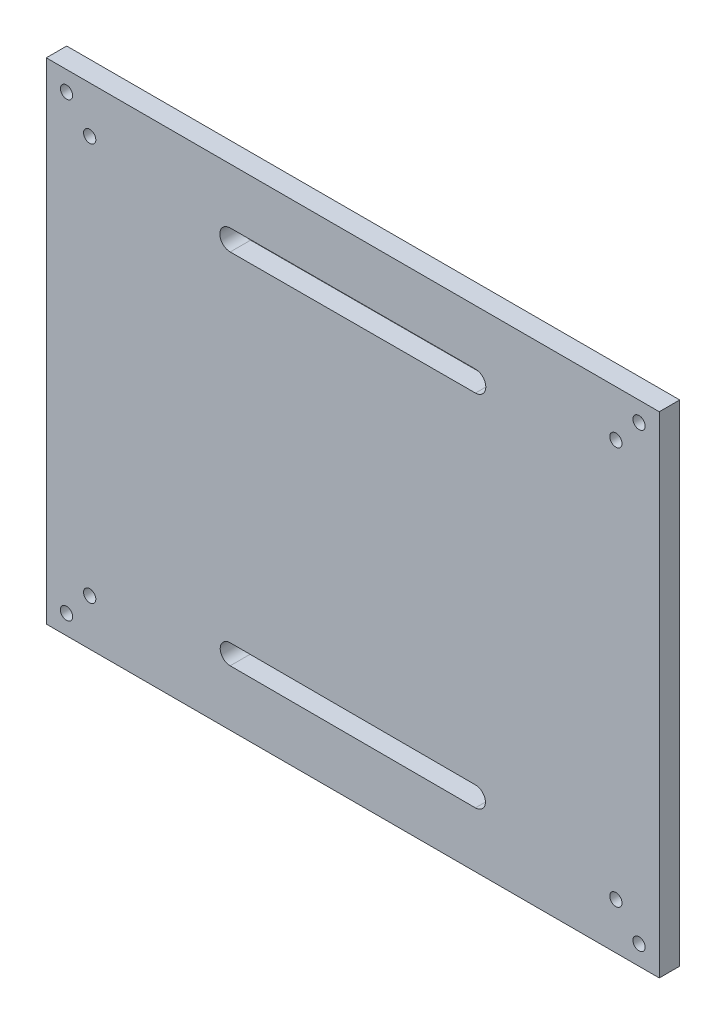
ISO-10303-21;
HEADER;
FILE_DESCRIPTION(('STEP AP214'),'2;1');
FILE_NAME('part.step','',(''),(''),'','','');
FILE_SCHEMA(('AUTOMOTIVE_DESIGN { 1 0 10303 214 1 1 1 1 }'));
ENDSEC;
DATA;
#1=APPLICATION_CONTEXT('core data for automotive mechanical design processes');
#2=APPLICATION_PROTOCOL_DEFINITION('international standard','automotive_design',2000,#1);
#3=PRODUCT_CONTEXT('',#1,'mechanical');
#4=PRODUCT('Part','Part','',(#3));
#5=PRODUCT_RELATED_PRODUCT_CATEGORY('part','',(#4));
#6=PRODUCT_DEFINITION_FORMATION('','',#4);
#7=PRODUCT_DEFINITION_CONTEXT('part definition',#1,'design');
#8=PRODUCT_DEFINITION('design','',#6,#7);
#9=PRODUCT_DEFINITION_SHAPE('','',#8);
#10=(LENGTH_UNIT() NAMED_UNIT(*) SI_UNIT(.MILLI.,.METRE.));
#11=(NAMED_UNIT(*) PLANE_ANGLE_UNIT() SI_UNIT($,.RADIAN.));
#12=(NAMED_UNIT(*) SI_UNIT($,.STERADIAN.) SOLID_ANGLE_UNIT());
#13=UNCERTAINTY_MEASURE_WITH_UNIT(LENGTH_MEASURE(1.E-05),#10,'distance_accuracy_value','');
#14=(GEOMETRIC_REPRESENTATION_CONTEXT(3) GLOBAL_UNCERTAINTY_ASSIGNED_CONTEXT((#13)) GLOBAL_UNIT_ASSIGNED_CONTEXT((#10,
#11,#12)) REPRESENTATION_CONTEXT('',''));
#15=CARTESIAN_POINT('',(0.,0.,0.));
#16=DIRECTION('',(0.,0.,1.));
#17=DIRECTION('',(1.,0.,0.));
#18=AXIS2_PLACEMENT_3D('',#15,#16,#17);
#19=CARTESIAN_POINT('',(0.,129.544898370349,5.));
#20=DIRECTION('',(0.,-1.,0.));
#21=DIRECTION('',(0.,0.,-1.));
#22=AXIS2_PLACEMENT_3D('',#19,#20,#21);
#23=PLANE('',#22);
#24=DIRECTION('',(-1.,0.,0.));
#25=VECTOR('',#24,1.);
#26=CARTESIAN_POINT('',(0.,129.544898370349,0.));
#27=LINE('',#26,#25);
#28=CARTESIAN_POINT('',(163.925313807853,129.544898370349,0.));
#29=VERTEX_POINT('',#28);
#30=CARTESIAN_POINT('',(13.9253138078526,129.544898370349,0.));
#31=VERTEX_POINT('',#30);
#32=EDGE_CURVE('E253',#29,#31,#27,.T.);
#33=ORIENTED_EDGE('',*,*,#32,.T.);
#34=DIRECTION('',(0.,0.,-1.));
#35=VECTOR('',#34,1.);
#36=CARTESIAN_POINT('',(13.9253138078526,129.544898370349,5.));
#37=LINE('',#36,#35);
#38=CARTESIAN_POINT('',(13.9253138078526,129.544898370349,5.));
#39=VERTEX_POINT('',#38);
#40=EDGE_CURVE('E11',#39,#31,#37,.T.);
#41=ORIENTED_EDGE('',*,*,#40,.F.);
#42=DIRECTION('',(-1.,0.,0.));
#43=VECTOR('',#42,1.);
#44=CARTESIAN_POINT('',(0.,129.544898370349,5.));
#45=LINE('',#44,#43);
#46=CARTESIAN_POINT('',(163.925313807853,129.544898370349,5.));
#47=VERTEX_POINT('',#46);
#48=EDGE_CURVE('E220',#47,#39,#45,.T.);
#49=ORIENTED_EDGE('',*,*,#48,.F.);
#50=DIRECTION('',(0.,0.,-1.));
#51=VECTOR('',#50,1.);
#52=CARTESIAN_POINT('',(163.925313807853,129.544898370349,5.));
#53=LINE('',#52,#51);
#54=EDGE_CURVE('E229',#47,#29,#53,.T.);
#55=ORIENTED_EDGE('',*,*,#54,.T.);
#56=EDGE_LOOP('',(#33,#41,#49,#55));
#57=FACE_BOUND('',#56,.T.);
#58=ADVANCED_FACE('F37',(#57),#23,.F.);
#59=CARTESIAN_POINT('',(13.9253138078526,0.,5.));
#60=DIRECTION('',(1.,0.,0.));
#61=DIRECTION('',(0.,0.,-1.));
#62=AXIS2_PLACEMENT_3D('',#59,#60,#61);
#63=PLANE('',#62);
#64=DIRECTION('',(0.,-1.,0.));
#65=VECTOR('',#64,1.);
#66=CARTESIAN_POINT('',(13.9253138078526,0.,0.));
#67=LINE('',#66,#65);
#68=CARTESIAN_POINT('',(13.9253138078526,9.5448983703489,0.));
#69=VERTEX_POINT('',#68);
#70=EDGE_CURVE('E256',#31,#69,#67,.T.);
#71=ORIENTED_EDGE('',*,*,#70,.T.);
#72=DIRECTION('',(0.,0.,-1.));
#73=VECTOR('',#72,1.);
#74=CARTESIAN_POINT('',(13.9253138078526,9.5448983703489,5.));
#75=LINE('',#74,#73);
#76=CARTESIAN_POINT('',(13.9253138078526,9.5448983703489,5.));
#77=VERTEX_POINT('',#76);
#78=EDGE_CURVE('E45',#77,#69,#75,.T.);
#79=ORIENTED_EDGE('',*,*,#78,.F.);
#80=DIRECTION('',(0.,-1.,0.));
#81=VECTOR('',#80,1.);
#82=CARTESIAN_POINT('',(13.9253138078526,0.,5.));
#83=LINE('',#82,#81);
#84=EDGE_CURVE('E223',#39,#77,#83,.T.);
#85=ORIENTED_EDGE('',*,*,#84,.F.);
#86=ORIENTED_EDGE('',*,*,#40,.T.);
#87=EDGE_LOOP('',(#71,#79,#85,#86));
#88=FACE_BOUND('',#87,.T.);
#89=ADVANCED_FACE('F285',(#88),#63,.F.);
#90=CARTESIAN_POINT('',(0.,9.5448983703489,5.));
#91=DIRECTION('',(0.,1.,0.));
#92=DIRECTION('',(-1.,0.,0.));
#93=AXIS2_PLACEMENT_3D('',#90,#91,#92);
#94=PLANE('',#93);
#95=DIRECTION('',(1.,0.,0.));
#96=VECTOR('',#95,1.);
#97=CARTESIAN_POINT('',(0.,9.5448983703489,0.));
#98=LINE('',#97,#96);
#99=CARTESIAN_POINT('',(163.925313807853,9.5448983703489,0.));
#100=VERTEX_POINT('',#99);
#101=EDGE_CURVE('E258',#69,#100,#98,.T.);
#102=ORIENTED_EDGE('',*,*,#101,.T.);
#103=DIRECTION('',(0.,0.,-1.));
#104=VECTOR('',#103,1.);
#105=CARTESIAN_POINT('',(163.925313807853,9.5448983703489,5.));
#106=LINE('',#105,#104);
#107=CARTESIAN_POINT('',(163.925313807853,9.5448983703489,5.));
#108=VERTEX_POINT('',#107);
#109=EDGE_CURVE('E263',#108,#100,#106,.T.);
#110=ORIENTED_EDGE('',*,*,#109,.F.);
#111=DIRECTION('',(1.,0.,0.));
#112=VECTOR('',#111,1.);
#113=CARTESIAN_POINT('',(0.,9.5448983703489,5.));
#114=LINE('',#113,#112);
#115=EDGE_CURVE('E225',#77,#108,#114,.T.);
#116=ORIENTED_EDGE('',*,*,#115,.F.);
#117=ORIENTED_EDGE('',*,*,#78,.T.);
#118=EDGE_LOOP('',(#102,#110,#116,#117));
#119=FACE_BOUND('',#118,.T.);
#120=ADVANCED_FACE('F270',(#119),#94,.F.);
#121=CARTESIAN_POINT('',(18.8799397984429,124.771335066389,5.));
#122=DIRECTION('',(0.,0.,-1.));
#123=DIRECTION('',(-1.,0.,0.));
#124=AXIS2_PLACEMENT_3D('',#121,#122,#123);
#125=CYLINDRICAL_SURFACE('',#124,1.5);
#126=CARTESIAN_POINT('',(18.8799397984429,124.771335066389,5.));
#127=DIRECTION('',(0.,0.,1.));
#128=DIRECTION('',(1.,0.,0.));
#129=AXIS2_PLACEMENT_3D('',#126,#127,#128);
#130=CIRCLE('',#129,1.5);
#131=CARTESIAN_POINT('',(20.3799397984429,124.771335066389,5.));
#132=VERTEX_POINT('',#131);
#133=EDGE_CURVE('E217',#132,#132,#130,.T.);
#134=ORIENTED_EDGE('',*,*,#133,.T.);
#135=EDGE_LOOP('',(#134));
#136=FACE_BOUND('',#135,.T.);
#137=CARTESIAN_POINT('',(18.8799397984429,124.771335066389,0.));
#138=DIRECTION('',(0.,0.,1.));
#139=DIRECTION('',(1.,0.,0.));
#140=AXIS2_PLACEMENT_3D('',#137,#138,#139);
#141=CIRCLE('',#140,1.5);
#142=CARTESIAN_POINT('',(20.3799397984429,124.771335066389,0.));
#143=VERTEX_POINT('',#142);
#144=EDGE_CURVE('E250',#143,#143,#141,.T.);
#145=ORIENTED_EDGE('',*,*,#144,.F.);
#146=EDGE_LOOP('',(#145));
#147=FACE_BOUND('',#146,.T.);
#148=ADVANCED_FACE('F292',(#136,#147),#125,.F.);
#149=CARTESIAN_POINT('',(158.970687817262,124.771335066389,5.));
#150=DIRECTION('',(0.,0.,-1.));
#151=DIRECTION('',(-1.,0.,0.));
#152=AXIS2_PLACEMENT_3D('',#149,#150,#151);
#153=CYLINDRICAL_SURFACE('',#152,1.5);
#154=CARTESIAN_POINT('',(158.970687817262,124.771335066389,5.));
#155=DIRECTION('',(0.,0.,1.));
#156=DIRECTION('',(1.,0.,0.));
#157=AXIS2_PLACEMENT_3D('',#154,#155,#156);
#158=CIRCLE('',#157,1.5);
#159=CARTESIAN_POINT('',(160.470687817262,124.771335066389,5.));
#160=VERTEX_POINT('',#159);
#161=EDGE_CURVE('E214',#160,#160,#158,.T.);
#162=ORIENTED_EDGE('',*,*,#161,.T.);
#163=EDGE_LOOP('',(#162));
#164=FACE_BOUND('',#163,.T.);
#165=CARTESIAN_POINT('',(158.970687817262,124.771335066389,0.));
#166=DIRECTION('',(0.,0.,1.));
#167=DIRECTION('',(1.,0.,0.));
#168=AXIS2_PLACEMENT_3D('',#165,#166,#167);
#169=CIRCLE('',#168,1.5);
#170=CARTESIAN_POINT('',(160.470687817262,124.771335066389,0.));
#171=VERTEX_POINT('',#170);
#172=EDGE_CURVE('E247',#171,#171,#169,.T.);
#173=ORIENTED_EDGE('',*,*,#172,.F.);
#174=EDGE_LOOP('',(#173));
#175=FACE_BOUND('',#174,.T.);
#176=ADVANCED_FACE('F299',(#164,#175),#153,.F.);
#177=CARTESIAN_POINT('',(18.8799397984429,14.3184616743089,5.));
#178=DIRECTION('',(0.,0.,-1.));
#179=DIRECTION('',(-1.,0.,0.));
#180=AXIS2_PLACEMENT_3D('',#177,#178,#179);
#181=CYLINDRICAL_SURFACE('',#180,1.5);
#182=CARTESIAN_POINT('',(18.8799397984429,14.3184616743089,5.));
#183=DIRECTION('',(0.,0.,1.));
#184=DIRECTION('',(1.,0.,0.));
#185=AXIS2_PLACEMENT_3D('',#182,#183,#184);
#186=CIRCLE('',#185,1.5);
#187=CARTESIAN_POINT('',(20.3799397984429,14.3184616743089,5.));
#188=VERTEX_POINT('',#187);
#189=EDGE_CURVE('E211',#188,#188,#186,.T.);
#190=ORIENTED_EDGE('',*,*,#189,.T.);
#191=EDGE_LOOP('',(#190));
#192=FACE_BOUND('',#191,.T.);
#193=CARTESIAN_POINT('',(18.8799397984429,14.3184616743089,0.));
#194=DIRECTION('',(0.,0.,1.));
#195=DIRECTION('',(1.,0.,0.));
#196=AXIS2_PLACEMENT_3D('',#193,#194,#195);
#197=CIRCLE('',#196,1.5);
#198=CARTESIAN_POINT('',(20.3799397984429,14.3184616743089,0.));
#199=VERTEX_POINT('',#198);
#200=EDGE_CURVE('E244',#199,#199,#197,.T.);
#201=ORIENTED_EDGE('',*,*,#200,.F.);
#202=EDGE_LOOP('',(#201));
#203=FACE_BOUND('',#202,.T.);
#204=ADVANCED_FACE('F303',(#192,#203),#181,.F.);
#205=CARTESIAN_POINT('',(158.970687817262,14.3184616743089,5.));
#206=DIRECTION('',(0.,0.,-1.));
#207=DIRECTION('',(-1.,0.,0.));
#208=AXIS2_PLACEMENT_3D('',#205,#206,#207);
#209=CYLINDRICAL_SURFACE('',#208,1.5);
#210=CARTESIAN_POINT('',(158.970687817262,14.3184616743089,5.));
#211=DIRECTION('',(0.,0.,1.));
#212=DIRECTION('',(1.,0.,0.));
#213=AXIS2_PLACEMENT_3D('',#210,#211,#212);
#214=CIRCLE('',#213,1.5);
#215=CARTESIAN_POINT('',(160.470687817262,14.3184616743089,5.));
#216=VERTEX_POINT('',#215);
#217=EDGE_CURVE('E208',#216,#216,#214,.T.);
#218=ORIENTED_EDGE('',*,*,#217,.T.);
#219=EDGE_LOOP('',(#218));
#220=FACE_BOUND('',#219,.T.);
#221=CARTESIAN_POINT('',(158.970687817262,14.3184616743089,0.));
#222=DIRECTION('',(0.,0.,1.));
#223=DIRECTION('',(1.,0.,0.));
#224=AXIS2_PLACEMENT_3D('',#221,#222,#223);
#225=CIRCLE('',#224,1.5);
#226=CARTESIAN_POINT('',(160.470687817262,14.3184616743089,0.));
#227=VERTEX_POINT('',#226);
#228=EDGE_CURVE('E241',#227,#227,#225,.T.);
#229=ORIENTED_EDGE('',*,*,#228,.F.);
#230=EDGE_LOOP('',(#229));
#231=FACE_BOUND('',#230,.T.);
#232=ADVANCED_FACE('F307',(#220,#231),#209,.F.);
#233=CARTESIAN_POINT('',(24.5486875411646,118.224668433934,5.));
#234=DIRECTION('',(0.,0.,-1.));
#235=DIRECTION('',(-1.,0.,0.));
#236=AXIS2_PLACEMENT_3D('',#233,#234,#235);
#237=CYLINDRICAL_SURFACE('',#236,1.5);
#238=CARTESIAN_POINT('',(24.5486875411646,118.224668433934,5.));
#239=DIRECTION('',(0.,0.,1.));
#240=DIRECTION('',(1.,0.,0.));
#241=AXIS2_PLACEMENT_3D('',#238,#239,#240);
#242=CIRCLE('',#241,1.5);
#243=CARTESIAN_POINT('',(26.0486875411646,118.224668433934,5.));
#244=VERTEX_POINT('',#243);
#245=EDGE_CURVE('E205',#244,#244,#242,.T.);
#246=ORIENTED_EDGE('',*,*,#245,.T.);
#247=EDGE_LOOP('',(#246));
#248=FACE_BOUND('',#247,.T.);
#249=CARTESIAN_POINT('',(24.5486875411646,118.224668433934,0.));
#250=DIRECTION('',(0.,0.,1.));
#251=DIRECTION('',(1.,0.,0.));
#252=AXIS2_PLACEMENT_3D('',#249,#250,#251);
#253=CIRCLE('',#252,1.5);
#254=CARTESIAN_POINT('',(26.0486875411646,118.224668433934,0.));
#255=VERTEX_POINT('',#254);
#256=EDGE_CURVE('E238',#255,#255,#253,.T.);
#257=ORIENTED_EDGE('',*,*,#256,.F.);
#258=EDGE_LOOP('',(#257));
#259=FACE_BOUND('',#258,.T.);
#260=ADVANCED_FACE('F311',(#248,#259),#237,.F.);
#261=CARTESIAN_POINT('',(153.301940074541,118.224668433934,5.));
#262=DIRECTION('',(0.,0.,-1.));
#263=DIRECTION('',(-1.,0.,0.));
#264=AXIS2_PLACEMENT_3D('',#261,#262,#263);
#265=CYLINDRICAL_SURFACE('',#264,1.5);
#266=CARTESIAN_POINT('',(153.301940074541,118.224668433934,5.));
#267=DIRECTION('',(0.,0.,1.));
#268=DIRECTION('',(1.,0.,0.));
#269=AXIS2_PLACEMENT_3D('',#266,#267,#268);
#270=CIRCLE('',#269,1.5);
#271=CARTESIAN_POINT('',(154.801940074541,118.224668433934,5.));
#272=VERTEX_POINT('',#271);
#273=EDGE_CURVE('E202',#272,#272,#270,.T.);
#274=ORIENTED_EDGE('',*,*,#273,.T.);
#275=EDGE_LOOP('',(#274));
#276=FACE_BOUND('',#275,.T.);
#277=CARTESIAN_POINT('',(153.301940074541,118.224668433934,0.));
#278=DIRECTION('',(0.,0.,1.));
#279=DIRECTION('',(1.,0.,0.));
#280=AXIS2_PLACEMENT_3D('',#277,#278,#279);
#281=CIRCLE('',#280,1.5);
#282=CARTESIAN_POINT('',(154.801940074541,118.224668433934,0.));
#283=VERTEX_POINT('',#282);
#284=EDGE_CURVE('E235',#283,#283,#281,.T.);
#285=ORIENTED_EDGE('',*,*,#284,.F.);
#286=EDGE_LOOP('',(#285));
#287=FACE_BOUND('',#286,.T.);
#288=ADVANCED_FACE('F315',(#276,#287),#265,.F.);
#289=CARTESIAN_POINT('',(24.5486875411646,20.8651283067638,5.));
#290=DIRECTION('',(0.,0.,-1.));
#291=DIRECTION('',(-1.,0.,0.));
#292=AXIS2_PLACEMENT_3D('',#289,#290,#291);
#293=CYLINDRICAL_SURFACE('',#292,1.5);
#294=CARTESIAN_POINT('',(24.5486875411646,20.8651283067638,5.));
#295=DIRECTION('',(0.,0.,1.));
#296=DIRECTION('',(1.,0.,0.));
#297=AXIS2_PLACEMENT_3D('',#294,#295,#296);
#298=CIRCLE('',#297,1.5);
#299=CARTESIAN_POINT('',(26.0486875411646,20.8651283067638,5.));
#300=VERTEX_POINT('',#299);
#301=EDGE_CURVE('E198',#300,#300,#298,.T.);
#302=ORIENTED_EDGE('',*,*,#301,.T.);
#303=EDGE_LOOP('',(#302));
#304=FACE_BOUND('',#303,.T.);
#305=CARTESIAN_POINT('',(24.5486875411646,20.8651283067638,0.));
#306=DIRECTION('',(0.,0.,1.));
#307=DIRECTION('',(1.,0.,0.));
#308=AXIS2_PLACEMENT_3D('',#305,#306,#307);
#309=CIRCLE('',#308,1.5);
#310=CARTESIAN_POINT('',(26.0486875411646,20.8651283067638,0.));
#311=VERTEX_POINT('',#310);
#312=EDGE_CURVE('E232',#311,#311,#309,.T.);
#313=ORIENTED_EDGE('',*,*,#312,.F.);
#314=EDGE_LOOP('',(#313));
#315=FACE_BOUND('',#314,.T.);
#316=ADVANCED_FACE('F318',(#304,#315),#293,.F.);
#317=CARTESIAN_POINT('',(153.301940074541,20.8651283067638,5.));
#318=DIRECTION('',(0.,0.,-1.));
#319=DIRECTION('',(-1.,0.,0.));
#320=AXIS2_PLACEMENT_3D('',#317,#318,#319);
#321=CYLINDRICAL_SURFACE('',#320,1.5);
#322=CARTESIAN_POINT('',(153.301940074541,20.8651283067638,5.));
#323=DIRECTION('',(0.,0.,1.));
#324=DIRECTION('',(1.,0.,0.));
#325=AXIS2_PLACEMENT_3D('',#322,#323,#324);
#326=CIRCLE('',#325,1.5);
#327=CARTESIAN_POINT('',(154.801940074541,20.8651283067638,5.));
#328=VERTEX_POINT('',#327);
#329=EDGE_CURVE('E195',#328,#328,#326,.T.);
#330=ORIENTED_EDGE('',*,*,#329,.T.);
#331=EDGE_LOOP('',(#330));
#332=FACE_BOUND('',#331,.T.);
#333=CARTESIAN_POINT('',(153.301940074541,20.8651283067638,0.));
#334=DIRECTION('',(0.,0.,1.));
#335=DIRECTION('',(1.,0.,0.));
#336=AXIS2_PLACEMENT_3D('',#333,#334,#335);
#337=CIRCLE('',#336,1.5);
#338=CARTESIAN_POINT('',(154.801940074541,20.8651283067638,0.));
#339=VERTEX_POINT('',#338);
#340=EDGE_CURVE('E188',#339,#339,#337,.T.);
#341=ORIENTED_EDGE('',*,*,#340,.F.);
#342=EDGE_LOOP('',(#341));
#343=FACE_BOUND('',#342,.T.);
#344=ADVANCED_FACE('F39',(#332,#343),#321,.F.);
#345=CARTESIAN_POINT('',(163.925313807853,0.,5.));
#346=DIRECTION('',(-1.,0.,0.));
#347=DIRECTION('',(0.,0.,1.));
#348=AXIS2_PLACEMENT_3D('',#345,#346,#347);
#349=PLANE('',#348);
#350=DIRECTION('',(0.,1.,0.));
#351=VECTOR('',#350,1.);
#352=CARTESIAN_POINT('',(163.925313807853,0.,0.));
#353=LINE('',#352,#351);
#354=EDGE_CURVE('E199',#100,#29,#353,.T.);
#355=ORIENTED_EDGE('',*,*,#354,.T.);
#356=ORIENTED_EDGE('',*,*,#54,.F.);
#357=DIRECTION('',(0.,1.,0.));
#358=VECTOR('',#357,1.);
#359=CARTESIAN_POINT('',(163.925313807853,0.,5.));
#360=LINE('',#359,#358);
#361=EDGE_CURVE('E227',#108,#47,#360,.T.);
#362=ORIENTED_EDGE('',*,*,#361,.F.);
#363=ORIENTED_EDGE('',*,*,#109,.T.);
#364=EDGE_LOOP('',(#355,#356,#362,#363));
#365=FACE_BOUND('',#364,.T.);
#366=ADVANCED_FACE('F279',(#365),#349,.F.);
#367=CARTESIAN_POINT('',(0.,0.,5.));
#368=DIRECTION('',(0.,0.,1.));
#369=DIRECTION('',(1.,0.,0.));
#370=AXIS2_PLACEMENT_3D('',#367,#368,#369);
#371=PLANE('',#370);
#372=CARTESIAN_POINT('',(58.9253138078526,25.6428866942727,5.));
#373=DIRECTION('',(0.,0.,-1.));
#374=DIRECTION('',(-1.,0.,0.));
#375=AXIS2_PLACEMENT_3D('',#372,#373,#374);
#376=CIRCLE('',#375,2.43880205576925);
#377=CARTESIAN_POINT('',(58.9210242159892,23.2040884109729,5.));
#378=VERTEX_POINT('',#377);
#379=CARTESIAN_POINT('',(58.929603399716,28.0816849775725,5.));
#380=VERTEX_POINT('',#379);
#381=EDGE_CURVE('E128',#378,#380,#376,.T.);
#382=ORIENTED_EDGE('',*,*,#381,.T.);
#383=DIRECTION('',(0.999998453146511,-0.00175889299964881,0.));
#384=VECTOR('',#383,1.);
#385=CARTESIAN_POINT('',(58.929603399716,28.0816849775725,5.));
#386=LINE('',#385,#384);
#387=CARTESIAN_POINT('',(118.938399167555,27.9761357635099,5.));
#388=VERTEX_POINT('',#387);
#389=EDGE_CURVE('E137',#380,#388,#386,.T.);
#390=ORIENTED_EDGE('',*,*,#389,.T.);
#391=CARTESIAN_POINT('',(118.934109575691,25.5373374802101,5.));
#392=DIRECTION('',(0.,0.,-1.));
#393=DIRECTION('',(-1.,0.,0.));
#394=AXIS2_PLACEMENT_3D('',#391,#392,#393);
#395=CIRCLE('',#394,2.43880205576925);
#396=CARTESIAN_POINT('',(118.929819983828,23.0985391969103,5.));
#397=VERTEX_POINT('',#396);
#398=EDGE_CURVE('E52',#388,#397,#395,.T.);
#399=ORIENTED_EDGE('',*,*,#398,.T.);
#400=DIRECTION('',(-0.999998453146511,0.00175889299964881,0.));
#401=VECTOR('',#400,1.);
#402=CARTESIAN_POINT('',(58.9210242159892,23.2040884109729,5.));
#403=LINE('',#402,#401);
#404=EDGE_CURVE('E134',#397,#378,#403,.T.);
#405=ORIENTED_EDGE('',*,*,#404,.T.);
#406=EDGE_LOOP('',(#382,#390,#399,#405));
#407=FACE_BOUND('',#406,.T.);
#408=CARTESIAN_POINT('',(58.9253138078526,113.446910046425,5.));
#409=DIRECTION('',(0.,0.,-1.));
#410=DIRECTION('',(-1.,0.,0.));
#411=AXIS2_PLACEMENT_3D('',#408,#409,#410);
#412=CIRCLE('',#411,2.54050559617077);
#413=CARTESIAN_POINT('',(58.9297822853613,110.906408380044,5.));
#414=VERTEX_POINT('',#413);
#415=CARTESIAN_POINT('',(58.9208453303439,115.987411712806,5.));
#416=VERTEX_POINT('',#415);
#417=EDGE_CURVE('E163',#414,#416,#412,.T.);
#418=ORIENTED_EDGE('',*,*,#417,.T.);
#419=DIRECTION('',(0.999998453146512,0.00175889299964893,0.));
#420=VECTOR('',#419,1.);
#421=CARTESIAN_POINT('',(58.9208453303439,115.987411712806,5.));
#422=LINE('',#421,#420);
#423=CARTESIAN_POINT('',(118.929641098182,116.092960926868,5.));
#424=VERTEX_POINT('',#423);
#425=EDGE_CURVE('E166',#416,#424,#422,.T.);
#426=ORIENTED_EDGE('',*,*,#425,.T.);
#427=CARTESIAN_POINT('',(118.934109575691,113.552459260488,5.));
#428=DIRECTION('',(0.,0.,-1.));
#429=DIRECTION('',(-1.,0.,0.));
#430=AXIS2_PLACEMENT_3D('',#427,#428,#429);
#431=CIRCLE('',#430,2.54050559617077);
#432=CARTESIAN_POINT('',(118.9385780532,111.011957594107,5.));
#433=VERTEX_POINT('',#432);
#434=EDGE_CURVE('E170',#424,#433,#431,.T.);
#435=ORIENTED_EDGE('',*,*,#434,.T.);
#436=DIRECTION('',(-0.999998453146512,-0.00175889299964893,0.));
#437=VECTOR('',#436,1.);
#438=CARTESIAN_POINT('',(58.9297822853613,110.906408380044,5.));
#439=LINE('',#438,#437);
#440=EDGE_CURVE('E173',#433,#414,#439,.T.);
#441=ORIENTED_EDGE('',*,*,#440,.T.);
#442=EDGE_LOOP('',(#418,#426,#435,#441));
#443=FACE_BOUND('',#442,.T.);
#444=ORIENTED_EDGE('',*,*,#329,.F.);
#445=EDGE_LOOP('',(#444));
#446=FACE_BOUND('',#445,.T.);
#447=ORIENTED_EDGE('',*,*,#301,.F.);
#448=EDGE_LOOP('',(#447));
#449=FACE_BOUND('',#448,.T.);
#450=ORIENTED_EDGE('',*,*,#273,.F.);
#451=EDGE_LOOP('',(#450));
#452=FACE_BOUND('',#451,.T.);
#453=ORIENTED_EDGE('',*,*,#245,.F.);
#454=EDGE_LOOP('',(#453));
#455=FACE_BOUND('',#454,.T.);
#456=ORIENTED_EDGE('',*,*,#217,.F.);
#457=EDGE_LOOP('',(#456));
#458=FACE_BOUND('',#457,.T.);
#459=ORIENTED_EDGE('',*,*,#189,.F.);
#460=EDGE_LOOP('',(#459));
#461=FACE_BOUND('',#460,.T.);
#462=ORIENTED_EDGE('',*,*,#161,.F.);
#463=EDGE_LOOP('',(#462));
#464=FACE_BOUND('',#463,.T.);
#465=ORIENTED_EDGE('',*,*,#133,.F.);
#466=EDGE_LOOP('',(#465));
#467=FACE_BOUND('',#466,.T.);
#468=ORIENTED_EDGE('',*,*,#48,.T.);
#469=ORIENTED_EDGE('',*,*,#84,.T.);
#470=ORIENTED_EDGE('',*,*,#115,.T.);
#471=ORIENTED_EDGE('',*,*,#361,.T.);
#472=EDGE_LOOP('',(#468,#469,#470,#471));
#473=FACE_BOUND('',#472,.T.);
#474=ADVANCED_FACE('F141',(#407,#443,#446,#449,#452,#455,#458,#461,#464,#467,#473),#371,.T.);
#475=CARTESIAN_POINT('',(0.,0.,0.));
#476=DIRECTION('',(0.,0.,1.));
#477=DIRECTION('',(1.,0.,0.));
#478=AXIS2_PLACEMENT_3D('',#475,#476,#477);
#479=PLANE('',#478);
#480=DIRECTION('',(0.999998453146511,-0.00175889299964881,0.));
#481=VECTOR('',#480,1.);
#482=CARTESIAN_POINT('',(58.929603399716,28.0816849775725,0.));
#483=LINE('',#482,#481);
#484=CARTESIAN_POINT('',(58.929603399716,28.0816849775725,0.));
#485=VERTEX_POINT('',#484);
#486=CARTESIAN_POINT('',(118.938399167555,27.9761357635099,0.));
#487=VERTEX_POINT('',#486);
#488=EDGE_CURVE('E153',#485,#487,#483,.T.);
#489=ORIENTED_EDGE('',*,*,#488,.F.);
#490=CARTESIAN_POINT('',(58.9253138078526,25.6428866942727,0.));
#491=DIRECTION('',(0.,0.,-1.));
#492=DIRECTION('',(-1.,0.,0.));
#493=AXIS2_PLACEMENT_3D('',#490,#491,#492);
#494=CIRCLE('',#493,2.43880205576925);
#495=CARTESIAN_POINT('',(58.9210242159892,23.2040884109729,0.));
#496=VERTEX_POINT('',#495);
#497=EDGE_CURVE('E60',#496,#485,#494,.T.);
#498=ORIENTED_EDGE('',*,*,#497,.F.);
#499=DIRECTION('',(-0.999998453146511,0.00175889299964881,0.));
#500=VECTOR('',#499,1.);
#501=CARTESIAN_POINT('',(58.9210242159892,23.2040884109729,0.));
#502=LINE('',#501,#500);
#503=CARTESIAN_POINT('',(118.929819983828,23.0985391969103,0.));
#504=VERTEX_POINT('',#503);
#505=EDGE_CURVE('E144',#504,#496,#502,.T.);
#506=ORIENTED_EDGE('',*,*,#505,.F.);
#507=CARTESIAN_POINT('',(118.934109575691,25.5373374802101,0.));
#508=DIRECTION('',(0.,0.,-1.));
#509=DIRECTION('',(-1.,0.,0.));
#510=AXIS2_PLACEMENT_3D('',#507,#508,#509);
#511=CIRCLE('',#510,2.43880205576925);
#512=EDGE_CURVE('E147',#487,#504,#511,.T.);
#513=ORIENTED_EDGE('',*,*,#512,.F.);
#514=EDGE_LOOP('',(#489,#498,#506,#513));
#515=FACE_BOUND('',#514,.T.);
#516=DIRECTION('',(0.999998453146512,0.00175889299964893,0.));
#517=VECTOR('',#516,1.);
#518=CARTESIAN_POINT('',(58.9208453303439,115.987411712806,0.));
#519=LINE('',#518,#517);
#520=CARTESIAN_POINT('',(58.9208453303439,115.987411712806,0.));
#521=VERTEX_POINT('',#520);
#522=CARTESIAN_POINT('',(118.929641098182,116.092960926869,0.));
#523=VERTEX_POINT('',#522);
#524=EDGE_CURVE('E178',#521,#523,#519,.T.);
#525=ORIENTED_EDGE('',*,*,#524,.F.);
#526=CARTESIAN_POINT('',(58.9253138078526,113.446910046425,0.));
#527=DIRECTION('',(0.,0.,-1.));
#528=DIRECTION('',(-1.,0.,0.));
#529=AXIS2_PLACEMENT_3D('',#526,#527,#528);
#530=CIRCLE('',#529,2.54050559617077);
#531=CARTESIAN_POINT('',(58.9297822853613,110.906408380044,0.));
#532=VERTEX_POINT('',#531);
#533=EDGE_CURVE('E159',#532,#521,#530,.T.);
#534=ORIENTED_EDGE('',*,*,#533,.F.);
#535=DIRECTION('',(-0.999998453146512,-0.00175889299964893,0.));
#536=VECTOR('',#535,1.);
#537=CARTESIAN_POINT('',(58.9297822853613,110.906408380044,0.));
#538=LINE('',#537,#536);
#539=CARTESIAN_POINT('',(118.9385780532,111.011957594107,0.));
#540=VERTEX_POINT('',#539);
#541=EDGE_CURVE('E167',#540,#532,#538,.T.);
#542=ORIENTED_EDGE('',*,*,#541,.F.);
#543=CARTESIAN_POINT('',(118.934109575691,113.552459260488,0.));
#544=DIRECTION('',(0.,0.,-1.));
#545=DIRECTION('',(-1.,0.,0.));
#546=AXIS2_PLACEMENT_3D('',#543,#544,#545);
#547=CIRCLE('',#546,2.54050559617077);
#548=EDGE_CURVE('E181',#523,#540,#547,.T.);
#549=ORIENTED_EDGE('',*,*,#548,.F.);
#550=EDGE_LOOP('',(#525,#534,#542,#549));
#551=FACE_BOUND('',#550,.T.);
#552=ORIENTED_EDGE('',*,*,#340,.T.);
#553=EDGE_LOOP('',(#552));
#554=FACE_BOUND('',#553,.T.);
#555=ORIENTED_EDGE('',*,*,#312,.T.);
#556=EDGE_LOOP('',(#555));
#557=FACE_BOUND('',#556,.T.);
#558=ORIENTED_EDGE('',*,*,#284,.T.);
#559=EDGE_LOOP('',(#558));
#560=FACE_BOUND('',#559,.T.);
#561=ORIENTED_EDGE('',*,*,#256,.T.);
#562=EDGE_LOOP('',(#561));
#563=FACE_BOUND('',#562,.T.);
#564=ORIENTED_EDGE('',*,*,#228,.T.);
#565=EDGE_LOOP('',(#564));
#566=FACE_BOUND('',#565,.T.);
#567=ORIENTED_EDGE('',*,*,#200,.T.);
#568=EDGE_LOOP('',(#567));
#569=FACE_BOUND('',#568,.T.);
#570=ORIENTED_EDGE('',*,*,#172,.T.);
#571=EDGE_LOOP('',(#570));
#572=FACE_BOUND('',#571,.T.);
#573=ORIENTED_EDGE('',*,*,#144,.T.);
#574=EDGE_LOOP('',(#573));
#575=FACE_BOUND('',#574,.T.);
#576=ORIENTED_EDGE('',*,*,#32,.F.);
#577=ORIENTED_EDGE('',*,*,#354,.F.);
#578=ORIENTED_EDGE('',*,*,#101,.F.);
#579=ORIENTED_EDGE('',*,*,#70,.F.);
#580=EDGE_LOOP('',(#576,#577,#578,#579));
#581=FACE_BOUND('',#580,.T.);
#582=ADVANCED_FACE('F276',(#515,#551,#554,#557,#560,#563,#566,#569,#572,#575,#581),#479,.F.);
#583=CARTESIAN_POINT('',(58.9253138078526,113.446910046425,5.));
#584=DIRECTION('',(0.,0.,-1.));
#585=DIRECTION('',(-1.,0.,0.));
#586=AXIS2_PLACEMENT_3D('',#583,#584,#585);
#587=CYLINDRICAL_SURFACE('',#586,2.54050559617077);
#588=ORIENTED_EDGE('',*,*,#533,.T.);
#589=DIRECTION('',(0.,0.,-1.));
#590=VECTOR('',#589,1.);
#591=CARTESIAN_POINT('',(58.9208453303439,115.987411712806,5.));
#592=LINE('',#591,#590);
#593=EDGE_CURVE('E176',#416,#521,#592,.T.);
#594=ORIENTED_EDGE('',*,*,#593,.F.);
#595=ORIENTED_EDGE('',*,*,#417,.F.);
#596=DIRECTION('',(0.,0.,-1.));
#597=VECTOR('',#596,1.);
#598=CARTESIAN_POINT('',(58.9297822853613,110.906408380044,5.));
#599=LINE('',#598,#597);
#600=EDGE_CURVE('E186',#414,#532,#599,.T.);
#601=ORIENTED_EDGE('',*,*,#600,.T.);
#602=EDGE_LOOP('',(#588,#594,#595,#601));
#603=FACE_BOUND('',#602,.T.);
#604=ADVANCED_FACE('F332',(#603),#587,.F.);
#605=CARTESIAN_POINT('',(58.9297822853613,110.906408380044,5.));
#606=DIRECTION('',(0.00175889299964893,-0.999998453146511,0.));
#607=DIRECTION('',(0.999998453146512,0.00175889299964893,0.));
#608=AXIS2_PLACEMENT_3D('',#605,#606,#607);
#609=PLANE('',#608);
#610=ORIENTED_EDGE('',*,*,#541,.T.);
#611=ORIENTED_EDGE('',*,*,#600,.F.);
#612=ORIENTED_EDGE('',*,*,#440,.F.);
#613=DIRECTION('',(0.,0.,-1.));
#614=VECTOR('',#613,1.);
#615=CARTESIAN_POINT('',(118.9385780532,111.011957594107,5.));
#616=LINE('',#615,#614);
#617=EDGE_CURVE('E189',#433,#540,#616,.T.);
#618=ORIENTED_EDGE('',*,*,#617,.T.);
#619=EDGE_LOOP('',(#610,#611,#612,#618));
#620=FACE_BOUND('',#619,.T.);
#621=ADVANCED_FACE('F356',(#620),#609,.F.);
#622=CARTESIAN_POINT('',(118.934109575691,113.552459260488,5.));
#623=DIRECTION('',(0.,0.,-1.));
#624=DIRECTION('',(-1.,0.,0.));
#625=AXIS2_PLACEMENT_3D('',#622,#623,#624);
#626=CYLINDRICAL_SURFACE('',#625,2.54050559617077);
#627=ORIENTED_EDGE('',*,*,#548,.T.);
#628=ORIENTED_EDGE('',*,*,#617,.F.);
#629=ORIENTED_EDGE('',*,*,#434,.F.);
#630=DIRECTION('',(0.,0.,-1.));
#631=VECTOR('',#630,1.);
#632=CARTESIAN_POINT('',(118.929641098182,116.092960926869,5.));
#633=LINE('',#632,#631);
#634=EDGE_CURVE('E191',#424,#523,#633,.T.);
#635=ORIENTED_EDGE('',*,*,#634,.T.);
#636=EDGE_LOOP('',(#627,#628,#629,#635));
#637=FACE_BOUND('',#636,.T.);
#638=ADVANCED_FACE('F389',(#637),#626,.F.);
#639=CARTESIAN_POINT('',(58.9208453303439,115.987411712806,5.));
#640=DIRECTION('',(-0.00175889299964893,0.999998453146511,0.));
#641=DIRECTION('',(-0.999998453146512,-0.00175889299964893,0.));
#642=AXIS2_PLACEMENT_3D('',#639,#640,#641);
#643=PLANE('',#642);
#644=ORIENTED_EDGE('',*,*,#524,.T.);
#645=ORIENTED_EDGE('',*,*,#634,.F.);
#646=ORIENTED_EDGE('',*,*,#425,.F.);
#647=ORIENTED_EDGE('',*,*,#593,.T.);
#648=EDGE_LOOP('',(#644,#645,#646,#647));
#649=FACE_BOUND('',#648,.T.);
#650=ADVANCED_FACE('F399',(#649),#643,.F.);
#651=CARTESIAN_POINT('',(58.9253138078526,25.6428866942727,5.));
#652=DIRECTION('',(0.,0.,-1.));
#653=DIRECTION('',(-1.,0.,0.));
#654=AXIS2_PLACEMENT_3D('',#651,#652,#653);
#655=CYLINDRICAL_SURFACE('',#654,2.43880205576925);
#656=ORIENTED_EDGE('',*,*,#497,.T.);
#657=DIRECTION('',(0.,0.,-1.));
#658=VECTOR('',#657,1.);
#659=CARTESIAN_POINT('',(58.929603399716,28.0816849775725,5.));
#660=LINE('',#659,#658);
#661=EDGE_CURVE('E124',#380,#485,#660,.T.);
#662=ORIENTED_EDGE('',*,*,#661,.F.);
#663=ORIENTED_EDGE('',*,*,#381,.F.);
#664=DIRECTION('',(0.,0.,-1.));
#665=VECTOR('',#664,1.);
#666=CARTESIAN_POINT('',(58.9210242159892,23.2040884109729,5.));
#667=LINE('',#666,#665);
#668=EDGE_CURVE('E157',#378,#496,#667,.T.);
#669=ORIENTED_EDGE('',*,*,#668,.T.);
#670=EDGE_LOOP('',(#656,#662,#663,#669));
#671=FACE_BOUND('',#670,.T.);
#672=ADVANCED_FACE('F126',(#671),#655,.F.);
#673=CARTESIAN_POINT('',(58.9210242159892,23.2040884109729,5.));
#674=DIRECTION('',(-0.00175889299964881,-0.999998453146511,0.));
#675=DIRECTION('',(0.999998453146512,-0.00175889299964881,0.));
#676=AXIS2_PLACEMENT_3D('',#673,#674,#675);
#677=PLANE('',#676);
#678=ORIENTED_EDGE('',*,*,#505,.T.);
#679=ORIENTED_EDGE('',*,*,#668,.F.);
#680=ORIENTED_EDGE('',*,*,#404,.F.);
#681=DIRECTION('',(0.,0.,-1.));
#682=VECTOR('',#681,1.);
#683=CARTESIAN_POINT('',(118.929819983828,23.0985391969103,5.));
#684=LINE('',#683,#682);
#685=EDGE_CURVE('E160',#397,#504,#684,.T.);
#686=ORIENTED_EDGE('',*,*,#685,.T.);
#687=EDGE_LOOP('',(#678,#679,#680,#686));
#688=FACE_BOUND('',#687,.T.);
#689=ADVANCED_FACE('F418',(#688),#677,.F.);
#690=CARTESIAN_POINT('',(118.934109575691,25.5373374802101,5.));
#691=DIRECTION('',(0.,0.,-1.));
#692=DIRECTION('',(-1.,0.,0.));
#693=AXIS2_PLACEMENT_3D('',#690,#691,#692);
#694=CYLINDRICAL_SURFACE('',#693,2.43880205576925);
#695=ORIENTED_EDGE('',*,*,#512,.T.);
#696=ORIENTED_EDGE('',*,*,#685,.F.);
#697=ORIENTED_EDGE('',*,*,#398,.F.);
#698=DIRECTION('',(0.,0.,-1.));
#699=VECTOR('',#698,1.);
#700=CARTESIAN_POINT('',(118.938399167555,27.9761357635099,5.));
#701=LINE('',#700,#699);
#702=EDGE_CURVE('E133',#388,#487,#701,.T.);
#703=ORIENTED_EDGE('',*,*,#702,.T.);
#704=EDGE_LOOP('',(#695,#696,#697,#703));
#705=FACE_BOUND('',#704,.T.);
#706=ADVANCED_FACE('F427',(#705),#694,.F.);
#707=CARTESIAN_POINT('',(58.929603399716,28.0816849775725,5.));
#708=DIRECTION('',(0.00175889299964881,0.999998453146511,0.));
#709=DIRECTION('',(-0.999998453146512,0.00175889299964881,0.));
#710=AXIS2_PLACEMENT_3D('',#707,#708,#709);
#711=PLANE('',#710);
#712=ORIENTED_EDGE('',*,*,#488,.T.);
#713=ORIENTED_EDGE('',*,*,#702,.F.);
#714=ORIENTED_EDGE('',*,*,#389,.F.);
#715=ORIENTED_EDGE('',*,*,#661,.T.);
#716=EDGE_LOOP('',(#712,#713,#714,#715));
#717=FACE_BOUND('',#716,.T.);
#718=ADVANCED_FACE('F138',(#717),#711,.F.);
#719=CLOSED_SHELL('',(#58,#89,#120,#148,#176,#204,#232,#260,#288,#316,#344,#366,#474,#582,#604,
#621,#638,#650,#672,#689,#706,#718));
#720=MANIFOLD_SOLID_BREP('B2',#719);
#721=ADVANCED_BREP_SHAPE_REPRESENTATION('',(#18,#720),#14);
#722=SHAPE_DEFINITION_REPRESENTATION(#9,#721);
ENDSEC;
END-ISO-10303-21;
